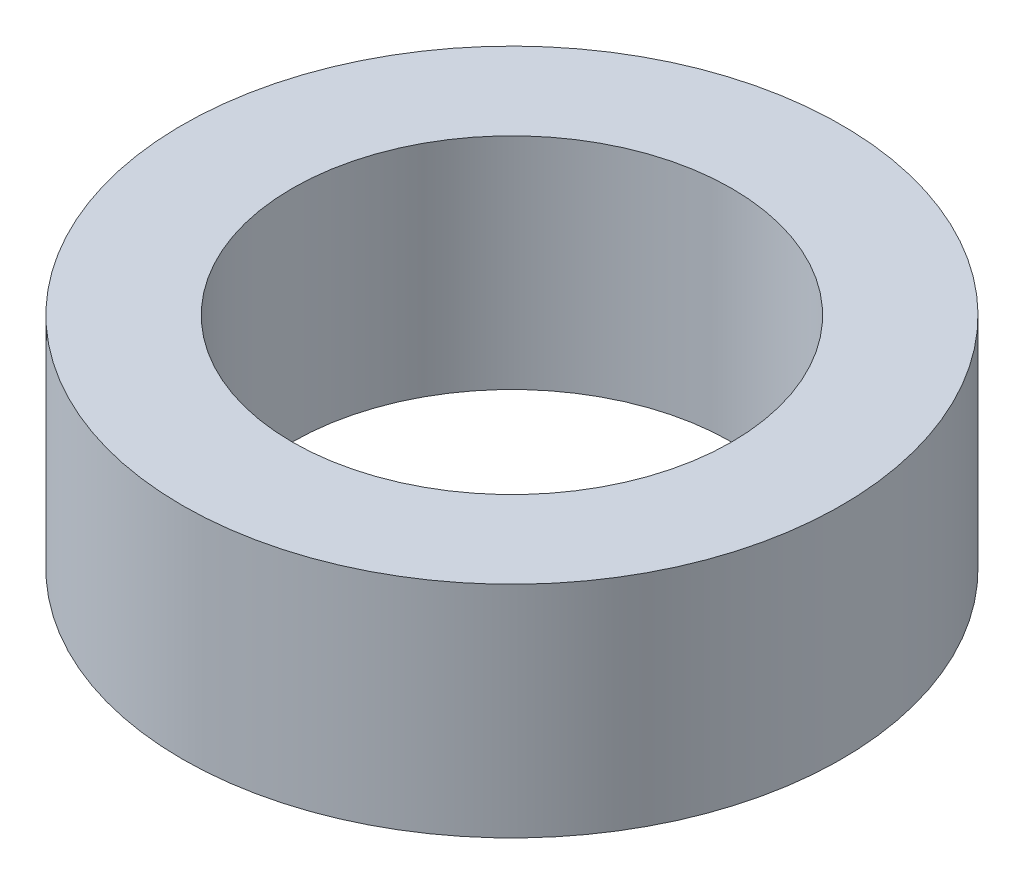
ISO-10303-21;
HEADER;
FILE_DESCRIPTION(('STEP AP214'),'2;1');
FILE_NAME('part.step','',(''),(''),'','','');
FILE_SCHEMA(('AUTOMOTIVE_DESIGN { 1 0 10303 214 1 1 1 1 }'));
ENDSEC;
DATA;
#1=APPLICATION_CONTEXT('core data for automotive mechanical design processes');
#2=APPLICATION_PROTOCOL_DEFINITION('international standard','automotive_design',2000,#1);
#3=PRODUCT_CONTEXT('',#1,'mechanical');
#4=PRODUCT('Part','Part','',(#3));
#5=PRODUCT_RELATED_PRODUCT_CATEGORY('part','',(#4));
#6=PRODUCT_DEFINITION_FORMATION('','',#4);
#7=PRODUCT_DEFINITION_CONTEXT('part definition',#1,'design');
#8=PRODUCT_DEFINITION('design','',#6,#7);
#9=PRODUCT_DEFINITION_SHAPE('','',#8);
#10=(LENGTH_UNIT() NAMED_UNIT(*) SI_UNIT(.MILLI.,.METRE.));
#11=(NAMED_UNIT(*) PLANE_ANGLE_UNIT() SI_UNIT($,.RADIAN.));
#12=(NAMED_UNIT(*) SI_UNIT($,.STERADIAN.) SOLID_ANGLE_UNIT());
#13=UNCERTAINTY_MEASURE_WITH_UNIT(LENGTH_MEASURE(1.E-05),#10,'distance_accuracy_value','');
#14=(GEOMETRIC_REPRESENTATION_CONTEXT(3) GLOBAL_UNCERTAINTY_ASSIGNED_CONTEXT((#13)) GLOBAL_UNIT_ASSIGNED_CONTEXT((#10,
#11,#12)) REPRESENTATION_CONTEXT('',''));
#15=CARTESIAN_POINT('',(0.,0.,0.));
#16=DIRECTION('',(0.,0.,1.));
#17=DIRECTION('',(1.,0.,0.));
#18=AXIS2_PLACEMENT_3D('',#15,#16,#17);
#19=CARTESIAN_POINT('',(0.,6.,0.));
#20=DIRECTION('',(0.,1.,0.));
#21=DIRECTION('',(0.,0.,1.));
#22=AXIS2_PLACEMENT_3D('',#19,#20,#21);
#23=PLANE('',#22);
#24=CARTESIAN_POINT('',(0.,6.,0.));
#25=DIRECTION('',(0.,1.,0.));
#26=DIRECTION('',(0.,0.,1.));
#27=AXIS2_PLACEMENT_3D('',#24,#25,#26);
#28=CIRCLE('',#27,9.);
#29=CARTESIAN_POINT('',(0.,6.,9.));
#30=VERTEX_POINT('',#29);
#31=EDGE_CURVE('E10',#30,#30,#28,.T.);
#32=ORIENTED_EDGE('',*,*,#31,.T.);
#33=EDGE_LOOP('',(#32));
#34=FACE_BOUND('',#33,.T.);
#35=CARTESIAN_POINT('',(0.,6.,0.));
#36=DIRECTION('',(0.,1.,0.));
#37=DIRECTION('',(0.,0.,1.));
#38=AXIS2_PLACEMENT_3D('',#35,#36,#37);
#39=CIRCLE('',#38,6.);
#40=CARTESIAN_POINT('',(0.,6.,6.));
#41=VERTEX_POINT('',#40);
#42=EDGE_CURVE('E42',#41,#41,#39,.T.);
#43=ORIENTED_EDGE('',*,*,#42,.F.);
#44=EDGE_LOOP('',(#43));
#45=FACE_BOUND('',#44,.T.);
#46=ADVANCED_FACE('F31',(#34,#45),#23,.T.);
#47=CARTESIAN_POINT('',(0.,0.,0.));
#48=DIRECTION('',(0.,1.,0.));
#49=DIRECTION('',(0.,0.,1.));
#50=AXIS2_PLACEMENT_3D('',#47,#48,#49);
#51=PLANE('',#50);
#52=CARTESIAN_POINT('',(0.,0.,0.));
#53=DIRECTION('',(0.,1.,0.));
#54=DIRECTION('',(0.,0.,1.));
#55=AXIS2_PLACEMENT_3D('',#52,#53,#54);
#56=CIRCLE('',#55,9.);
#57=CARTESIAN_POINT('',(0.,0.,9.));
#58=VERTEX_POINT('',#57);
#59=EDGE_CURVE('E35',#58,#58,#56,.T.);
#60=ORIENTED_EDGE('',*,*,#59,.F.);
#61=EDGE_LOOP('',(#60));
#62=FACE_BOUND('',#61,.T.);
#63=CARTESIAN_POINT('',(0.,0.,0.));
#64=DIRECTION('',(0.,1.,0.));
#65=DIRECTION('',(0.,0.,1.));
#66=AXIS2_PLACEMENT_3D('',#63,#64,#65);
#67=CIRCLE('',#66,6.);
#68=CARTESIAN_POINT('',(0.,0.,6.));
#69=VERTEX_POINT('',#68);
#70=EDGE_CURVE('E44',#69,#69,#67,.T.);
#71=ORIENTED_EDGE('',*,*,#70,.T.);
#72=EDGE_LOOP('',(#71));
#73=FACE_BOUND('',#72,.T.);
#74=ADVANCED_FACE('F54',(#62,#73),#51,.F.);
#75=CARTESIAN_POINT('',(0.,6.,0.));
#76=DIRECTION('',(0.,-1.,0.));
#77=DIRECTION('',(0.,0.,-1.));
#78=AXIS2_PLACEMENT_3D('',#75,#76,#77);
#79=CYLINDRICAL_SURFACE('',#78,9.);
#80=ORIENTED_EDGE('',*,*,#31,.F.);
#81=EDGE_LOOP('',(#80));
#82=FACE_BOUND('',#81,.T.);
#83=ORIENTED_EDGE('',*,*,#59,.T.);
#84=EDGE_LOOP('',(#83));
#85=FACE_BOUND('',#84,.T.);
#86=ADVANCED_FACE('F33',(#82,#85),#79,.T.);
#87=CARTESIAN_POINT('',(0.,6.,0.));
#88=DIRECTION('',(0.,-1.,0.));
#89=DIRECTION('',(0.,0.,-1.));
#90=AXIS2_PLACEMENT_3D('',#87,#88,#89);
#91=CYLINDRICAL_SURFACE('',#90,6.);
#92=ORIENTED_EDGE('',*,*,#42,.T.);
#93=EDGE_LOOP('',(#92));
#94=FACE_BOUND('',#93,.T.);
#95=ORIENTED_EDGE('',*,*,#70,.F.);
#96=EDGE_LOOP('',(#95));
#97=FACE_BOUND('',#96,.T.);
#98=ADVANCED_FACE('F50',(#94,#97),#91,.F.);
#99=CLOSED_SHELL('',(#46,#74,#86,#98));
#100=MANIFOLD_SOLID_BREP('B2',#99);
#101=ADVANCED_BREP_SHAPE_REPRESENTATION('',(#18,#100),#14);
#102=SHAPE_DEFINITION_REPRESENTATION(#9,#101);
ENDSEC;
END-ISO-10303-21;
